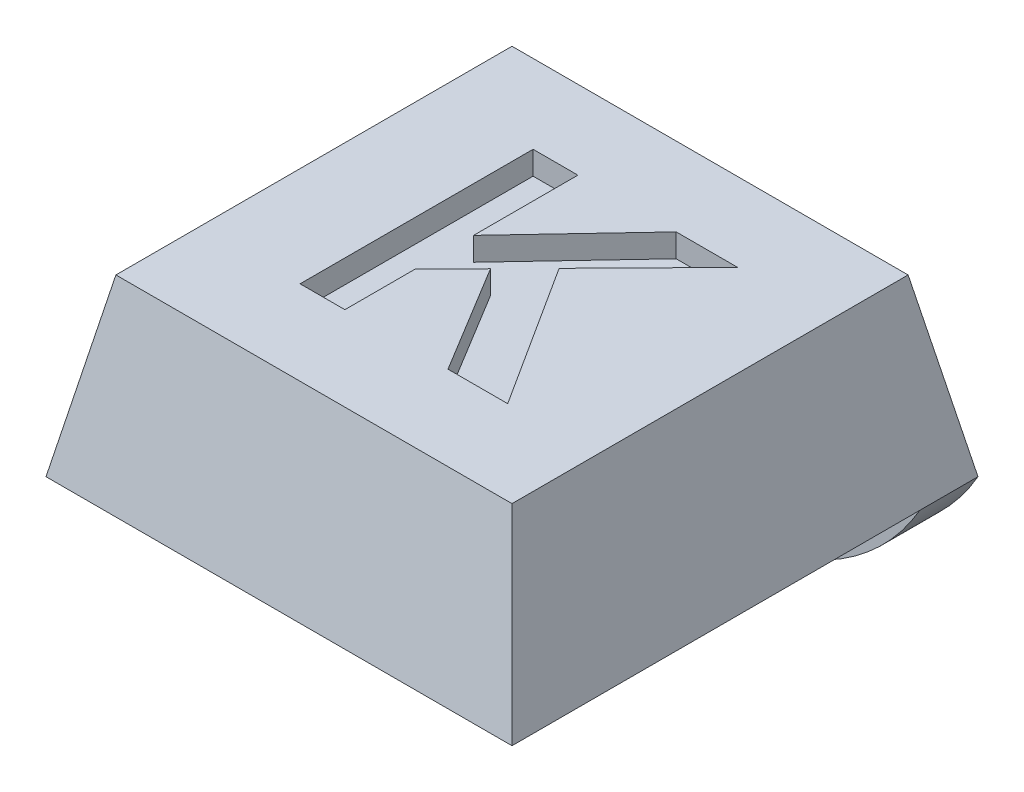
ISO-10303-21;
HEADER;
FILE_DESCRIPTION(('STEP AP214'),'2;1');
FILE_NAME('part.step','',(''),(''),'','','');
FILE_SCHEMA(('AUTOMOTIVE_DESIGN { 1 0 10303 214 1 1 1 1 }'));
ENDSEC;
DATA;
#1=APPLICATION_CONTEXT('core data for automotive mechanical design processes');
#2=APPLICATION_PROTOCOL_DEFINITION('international standard','automotive_design',2000,#1);
#3=PRODUCT_CONTEXT('',#1,'mechanical');
#4=PRODUCT('Part','Part','',(#3));
#5=PRODUCT_RELATED_PRODUCT_CATEGORY('part','',(#4));
#6=PRODUCT_DEFINITION_FORMATION('','',#4);
#7=PRODUCT_DEFINITION_CONTEXT('part definition',#1,'design');
#8=PRODUCT_DEFINITION('design','',#6,#7);
#9=PRODUCT_DEFINITION_SHAPE('','',#8);
#10=(LENGTH_UNIT() NAMED_UNIT(*) SI_UNIT(.MILLI.,.METRE.));
#11=(NAMED_UNIT(*) PLANE_ANGLE_UNIT() SI_UNIT($,.RADIAN.));
#12=(NAMED_UNIT(*) SI_UNIT($,.STERADIAN.) SOLID_ANGLE_UNIT());
#13=UNCERTAINTY_MEASURE_WITH_UNIT(LENGTH_MEASURE(1.E-05),#10,'distance_accuracy_value','');
#14=(GEOMETRIC_REPRESENTATION_CONTEXT(3) GLOBAL_UNCERTAINTY_ASSIGNED_CONTEXT((#13)) GLOBAL_UNIT_ASSIGNED_CONTEXT((#10,
#11,#12)) REPRESENTATION_CONTEXT('',''));
#15=CARTESIAN_POINT('',(0.,0.,0.));
#16=DIRECTION('',(0.,0.,1.));
#17=DIRECTION('',(1.,0.,0.));
#18=AXIS2_PLACEMENT_3D('',#15,#16,#17);
#19=CARTESIAN_POINT('',(0.,3.,0.));
#20=DIRECTION('',(0.,-1.,0.));
#21=DIRECTION('',(0.,0.,-1.));
#22=AXIS2_PLACEMENT_3D('',#19,#20,#21);
#23=PLANE('',#22);
#24=DIRECTION('',(-1.,0.,0.));
#25=VECTOR('',#24,1.);
#26=CARTESIAN_POINT('',(11.,3.,-0.6));
#27=LINE('',#26,#25);
#28=CARTESIAN_POINT('',(7.4,3.,-0.6));
#29=VERTEX_POINT('',#28);
#30=CARTESIAN_POINT('',(0.6,3.,-0.6));
#31=VERTEX_POINT('',#30);
#32=EDGE_CURVE('E229',#29,#31,#27,.T.);
#33=ORIENTED_EDGE('',*,*,#32,.F.);
#34=DIRECTION('',(0.,0.,1.));
#35=VECTOR('',#34,1.);
#36=CARTESIAN_POINT('',(7.4,3.,-8.));
#37=LINE('',#36,#35);
#38=CARTESIAN_POINT('',(7.4,3.,-7.4));
#39=VERTEX_POINT('',#38);
#40=EDGE_CURVE('E242',#39,#29,#37,.T.);
#41=ORIENTED_EDGE('',*,*,#40,.F.);
#42=DIRECTION('',(-1.,0.,0.));
#43=VECTOR('',#42,1.);
#44=CARTESIAN_POINT('',(11.,3.,-7.4));
#45=LINE('',#44,#43);
#46=CARTESIAN_POINT('',(0.599999999999999,3.,-7.4));
#47=VERTEX_POINT('',#46);
#48=EDGE_CURVE('E225',#39,#47,#45,.T.);
#49=ORIENTED_EDGE('',*,*,#48,.T.);
#50=DIRECTION('',(0.,0.,1.));
#51=VECTOR('',#50,1.);
#52=CARTESIAN_POINT('',(0.6,3.,-8.));
#53=LINE('',#52,#51);
#54=EDGE_CURVE('E245',#47,#31,#53,.T.);
#55=ORIENTED_EDGE('',*,*,#54,.T.);
#56=EDGE_LOOP('',(#33,#41,#49,#55));
#57=FACE_BOUND('',#56,.T.);
#58=DIRECTION('',(-1.,0.,0.));
#59=VECTOR('',#58,1.);
#60=CARTESIAN_POINT('',(3.08212967996157,3.,-2.04912159051481));
#61=LINE('',#60,#59);
#62=CARTESIAN_POINT('',(3.08212967996157,3.,-2.04912159051481));
#63=VERTEX_POINT('',#62);
#64=CARTESIAN_POINT('',(2.3128989107308,3.,-2.04912159051481));
#65=VERTEX_POINT('',#64);
#66=EDGE_CURVE('E58',#63,#65,#61,.T.);
#67=ORIENTED_EDGE('',*,*,#66,.T.);
#68=DIRECTION('',(0.,0.,-1.));
#69=VECTOR('',#68,1.);
#70=CARTESIAN_POINT('',(2.3128989107308,3.,-2.04912159051481));
#71=LINE('',#70,#69);
#72=CARTESIAN_POINT('',(2.3128989107308,3.,-6.04912159051481));
#73=VERTEX_POINT('',#72);
#74=EDGE_CURVE('E197',#65,#73,#71,.T.);
#75=ORIENTED_EDGE('',*,*,#74,.T.);
#76=DIRECTION('',(1.,0.,0.));
#77=VECTOR('',#76,1.);
#78=CARTESIAN_POINT('',(2.3128989107308,3.,-6.04912159051481));
#79=LINE('',#78,#77);
#80=CARTESIAN_POINT('',(3.08212967996157,3.,-6.04912159051481));
#81=VERTEX_POINT('',#80);
#82=EDGE_CURVE('E666',#73,#81,#79,.T.);
#83=ORIENTED_EDGE('',*,*,#82,.T.);
#84=DIRECTION('',(0.,0.,1.));
#85=VECTOR('',#84,1.);
#86=CARTESIAN_POINT('',(3.08212967996157,3.,-6.04912159051481));
#87=LINE('',#86,#85);
#88=CARTESIAN_POINT('',(3.08212967996157,3.,-4.25825620589942));
#89=VERTEX_POINT('',#88);
#90=EDGE_CURVE('E668',#81,#89,#87,.T.);
#91=ORIENTED_EDGE('',*,*,#90,.T.);
#92=DIRECTION('',(0.685618651018228,0.,-0.727960895499164));
#93=VECTOR('',#92,1.);
#94=CARTESIAN_POINT('',(3.08212967996157,3.,-4.25825620589942));
#95=LINE('',#94,#93);
#96=CARTESIAN_POINT('',(4.76882839791029,3.,-6.04912159051481));
#97=VERTEX_POINT('',#96);
#98=EDGE_CURVE('E673',#89,#97,#95,.T.);
#99=ORIENTED_EDGE('',*,*,#98,.T.);
#100=DIRECTION('',(1.,0.,0.));
#101=VECTOR('',#100,1.);
#102=CARTESIAN_POINT('',(4.76882839791029,3.,-6.04912159051481));
#103=LINE('',#102,#101);
#104=CARTESIAN_POINT('',(5.82571942355132,3.,-6.04912159051481));
#105=VERTEX_POINT('',#104);
#106=EDGE_CURVE('E683',#97,#105,#103,.T.);
#107=ORIENTED_EDGE('',*,*,#106,.T.);
#108=DIRECTION('',(-0.700795359660879,0.,0.713362365055642));
#109=VECTOR('',#108,1.);
#110=CARTESIAN_POINT('',(5.82571942355132,3.,-6.04912159051481));
#111=LINE('',#110,#109);
#112=CARTESIAN_POINT('',(4.30648865432055,3.,-4.50264723154045));
#113=VERTEX_POINT('',#112);
#114=EDGE_CURVE('E687',#105,#113,#111,.T.);
#115=ORIENTED_EDGE('',*,*,#114,.T.);
#116=DIRECTION('',(0.53911613745139,0.,0.842231435140896));
#117=VECTOR('',#116,1.);
#118=CARTESIAN_POINT('',(4.30648865432055,3.,-4.50264723154045));
#119=LINE('',#118,#117);
#120=CARTESIAN_POINT('',(5.87700147483337,3.,-2.04912159051481));
#121=VERTEX_POINT('',#120);
#122=EDGE_CURVE('E691',#113,#121,#119,.T.);
#123=ORIENTED_EDGE('',*,*,#122,.T.);
#124=DIRECTION('',(-1.,0.,0.));
#125=VECTOR('',#124,1.);
#126=CARTESIAN_POINT('',(5.87700147483337,3.,-2.04912159051481));
#127=LINE('',#126,#125);
#128=CARTESIAN_POINT('',(4.85216173124363,3.,-2.04912159051481));
#129=VERTEX_POINT('',#128);
#130=EDGE_CURVE('E632',#121,#129,#127,.T.);
#131=ORIENTED_EDGE('',*,*,#130,.T.);
#132=DIRECTION('',(-0.519256993232864,0.,-0.854618145711151));
#133=VECTOR('',#132,1.);
#134=CARTESIAN_POINT('',(4.85216173124363,3.,-2.04912159051481));
#135=LINE('',#134,#133);
#136=CARTESIAN_POINT('',(3.72315532098721,3.,-3.90729466743788));
#137=VERTEX_POINT('',#136);
#138=EDGE_CURVE('E627',#129,#137,#135,.T.);
#139=ORIENTED_EDGE('',*,*,#138,.T.);
#140=DIRECTION('',(-0.70094689597696,0.,0.713213466656557));
#141=VECTOR('',#140,1.);
#142=CARTESIAN_POINT('',(3.72315532098721,3.,-3.90729466743788));
#143=LINE('',#142,#141);
#144=CARTESIAN_POINT('',(3.08212967996157,3.,-3.25505107769429));
#145=VERTEX_POINT('',#144);
#146=EDGE_CURVE('E621',#137,#145,#143,.T.);
#147=ORIENTED_EDGE('',*,*,#146,.T.);
#148=DIRECTION('',(0.,0.,1.));
#149=VECTOR('',#148,1.);
#150=CARTESIAN_POINT('',(3.08212967996157,3.,-3.25505107769429));
#151=LINE('',#150,#149);
#152=EDGE_CURVE('E193',#145,#63,#151,.T.);
#153=ORIENTED_EDGE('',*,*,#152,.T.);
#154=EDGE_LOOP('',(#67,#75,#83,#91,#99,#107,#115,#123,#131,#139,#147,#153));
#155=FACE_BOUND('',#154,.T.);
#156=ADVANCED_FACE('F42',(#57,#155),#23,.F.);
#157=CARTESIAN_POINT('',(8.,0.,-8.));
#158=DIRECTION('',(-0.98058067569092,-0.196116135138184,0.));
#159=DIRECTION('',(0.196116135138184,-0.98058067569092,0.));
#160=AXIS2_PLACEMENT_3D('',#157,#158,#159);
#161=PLANE('',#160);
#162=DIRECTION('',(-0.192450089729875,0.962250448649376,-0.192450089729875));
#163=VECTOR('',#162,1.);
#164=CARTESIAN_POINT('',(7.7037037037037,1.48148148148148,-0.296296296296296));
#165=LINE('',#164,#163);
#166=CARTESIAN_POINT('',(8.,0.,0.));
#167=VERTEX_POINT('',#166);
#168=EDGE_CURVE('E239',#167,#29,#165,.T.);
#169=ORIENTED_EDGE('',*,*,#168,.F.);
#170=DIRECTION('',(0.,0.,-1.));
#171=VECTOR('',#170,1.);
#172=CARTESIAN_POINT('',(8.,0.,0.));
#173=LINE('',#172,#171);
#174=CARTESIAN_POINT('',(8.,0.,-7.));
#175=VERTEX_POINT('',#174);
#176=EDGE_CURVE('E258',#167,#175,#173,.T.);
#177=ORIENTED_EDGE('',*,*,#176,.T.);
#178=DIRECTION('',(0.,0.,1.));
#179=VECTOR('',#178,1.);
#180=CARTESIAN_POINT('',(8.,0.,-8.));
#181=LINE('',#180,#179);
#182=CARTESIAN_POINT('',(8.,0.,-8.));
#183=VERTEX_POINT('',#182);
#184=EDGE_CURVE('E199',#183,#175,#181,.T.);
#185=ORIENTED_EDGE('',*,*,#184,.F.);
#186=DIRECTION('',(0.192450089729875,-0.962250448649376,-0.192450089729875));
#187=VECTOR('',#186,1.);
#188=CARTESIAN_POINT('',(8.,0.,-8.));
#189=LINE('',#188,#187);
#190=EDGE_CURVE('E232',#39,#183,#189,.T.);
#191=ORIENTED_EDGE('',*,*,#190,.F.);
#192=ORIENTED_EDGE('',*,*,#40,.T.);
#193=EDGE_LOOP('',(#169,#177,#185,#191,#192));
#194=FACE_BOUND('',#193,.T.);
#195=ADVANCED_FACE('F326',(#194),#161,.F.);
#196=CARTESIAN_POINT('',(0.,0.,-8.));
#197=DIRECTION('',(0.98058067569092,-0.196116135138184,0.));
#198=DIRECTION('',(0.196116135138184,0.98058067569092,0.));
#199=AXIS2_PLACEMENT_3D('',#196,#197,#198);
#200=PLANE('',#199);
#201=DIRECTION('',(-0.192450089729875,-0.962250448649376,0.192450089729875));
#202=VECTOR('',#201,1.);
#203=CARTESIAN_POINT('',(0.296296296296296,1.48148148148148,-0.296296296296296));
#204=LINE('',#203,#202);
#205=CARTESIAN_POINT('',(0.,0.,0.));
#206=VERTEX_POINT('',#205);
#207=EDGE_CURVE('E286',#31,#206,#204,.T.);
#208=ORIENTED_EDGE('',*,*,#207,.F.);
#209=ORIENTED_EDGE('',*,*,#54,.F.);
#210=DIRECTION('',(0.192450089729875,0.962250448649376,0.192450089729875));
#211=VECTOR('',#210,1.);
#212=CARTESIAN_POINT('',(0.,0.,-8.));
#213=LINE('',#212,#211);
#214=CARTESIAN_POINT('',(0.,0.,-8.));
#215=VERTEX_POINT('',#214);
#216=EDGE_CURVE('E257',#215,#47,#213,.T.);
#217=ORIENTED_EDGE('',*,*,#216,.F.);
#218=DIRECTION('',(0.,0.,1.));
#219=VECTOR('',#218,1.);
#220=CARTESIAN_POINT('',(0.,0.,0.));
#221=LINE('',#220,#219);
#222=CARTESIAN_POINT('',(0.,0.,-7.));
#223=VERTEX_POINT('',#222);
#224=EDGE_CURVE('E262',#215,#223,#221,.T.);
#225=ORIENTED_EDGE('',*,*,#224,.T.);
#226=EDGE_CURVE('E249',#223,#206,#221,.T.);
#227=ORIENTED_EDGE('',*,*,#226,.T.);
#228=EDGE_LOOP('',(#208,#209,#217,#225,#227));
#229=FACE_BOUND('',#228,.T.);
#230=ADVANCED_FACE('F310',(#229),#200,.F.);
#231=CARTESIAN_POINT('',(0.,0.,0.));
#232=DIRECTION('',(0.,-1.,0.));
#233=DIRECTION('',(0.,0.,-1.));
#234=AXIS2_PLACEMENT_3D('',#231,#232,#233);
#235=PLANE('',#234);
#236=DIRECTION('',(-1.,0.,0.));
#237=VECTOR('',#236,1.);
#238=CARTESIAN_POINT('',(0.,0.,-7.));
#239=LINE('',#238,#237);
#240=EDGE_CURVE('E205',#175,#223,#239,.T.);
#241=ORIENTED_EDGE('',*,*,#240,.F.);
#242=ORIENTED_EDGE('',*,*,#176,.F.);
#243=DIRECTION('',(1.,0.,0.));
#244=VECTOR('',#243,1.);
#245=CARTESIAN_POINT('',(0.,0.,0.));
#246=LINE('',#245,#244);
#247=EDGE_CURVE('E259',#206,#167,#246,.T.);
#248=ORIENTED_EDGE('',*,*,#247,.F.);
#249=ORIENTED_EDGE('',*,*,#226,.F.);
#250=EDGE_LOOP('',(#241,#242,#248,#249));
#251=FACE_BOUND('',#250,.T.);
#252=CARTESIAN_POINT('',(4.,0.,-3.75));
#253=DIRECTION('',(0.,-1.,0.));
#254=DIRECTION('',(0.,0.,-1.));
#255=AXIS2_PLACEMENT_3D('',#252,#253,#254);
#256=CIRCLE('',#255,1.8);
#257=CARTESIAN_POINT('',(4.,0.,-5.55));
#258=VERTEX_POINT('',#257);
#259=EDGE_CURVE('E217',#258,#258,#256,.T.);
#260=ORIENTED_EDGE('',*,*,#259,.F.);
#261=EDGE_LOOP('',(#260));
#262=FACE_BOUND('',#261,.T.);
#263=ADVANCED_FACE('F321',(#251,#262),#235,.T.);
#264=CARTESIAN_POINT('',(11.,3.,-7.4));
#265=DIRECTION('',(0.,0.196116135138184,-0.98058067569092));
#266=DIRECTION('',(0.,0.98058067569092,0.196116135138184));
#267=AXIS2_PLACEMENT_3D('',#264,#265,#266);
#268=PLANE('',#267);
#269=ORIENTED_EDGE('',*,*,#190,.T.);
#270=DIRECTION('',(-1.,0.,0.));
#271=VECTOR('',#270,1.);
#272=CARTESIAN_POINT('',(0.,0.,-8.));
#273=LINE('',#272,#271);
#274=EDGE_CURVE('E253',#183,#215,#273,.T.);
#275=ORIENTED_EDGE('',*,*,#274,.T.);
#276=ORIENTED_EDGE('',*,*,#216,.T.);
#277=ORIENTED_EDGE('',*,*,#48,.F.);
#278=EDGE_LOOP('',(#269,#275,#276,#277));
#279=FACE_BOUND('',#278,.T.);
#280=ADVANCED_FACE('F305',(#279),#268,.T.);
#281=CARTESIAN_POINT('',(11.,0.,0.));
#282=DIRECTION('',(0.,0.196116135138184,0.98058067569092));
#283=DIRECTION('',(0.,-0.98058067569092,0.196116135138184));
#284=AXIS2_PLACEMENT_3D('',#281,#282,#283);
#285=PLANE('',#284);
#286=ORIENTED_EDGE('',*,*,#168,.T.);
#287=ORIENTED_EDGE('',*,*,#32,.T.);
#288=ORIENTED_EDGE('',*,*,#207,.T.);
#289=ORIENTED_EDGE('',*,*,#247,.T.);
#290=EDGE_LOOP('',(#286,#287,#288,#289));
#291=FACE_BOUND('',#290,.T.);
#292=ADVANCED_FACE('F352',(#291),#285,.T.);
#293=CARTESIAN_POINT('',(4.,0.8,-3.75));
#294=DIRECTION('',(0.,-1.,0.));
#295=DIRECTION('',(0.,0.,-1.));
#296=AXIS2_PLACEMENT_3D('',#293,#294,#295);
#297=CYLINDRICAL_SURFACE('',#296,1.8);
#298=CARTESIAN_POINT('',(4.,0.8,-3.75));
#299=DIRECTION('',(0.,-1.,0.));
#300=DIRECTION('',(0.,0.,-1.));
#301=AXIS2_PLACEMENT_3D('',#298,#299,#300);
#302=CIRCLE('',#301,1.8);
#303=CARTESIAN_POINT('',(4.,0.8,-5.55));
#304=VERTEX_POINT('',#303);
#305=EDGE_CURVE('E221',#304,#304,#302,.T.);
#306=ORIENTED_EDGE('',*,*,#305,.F.);
#307=EDGE_LOOP('',(#306));
#308=FACE_BOUND('',#307,.T.);
#309=ORIENTED_EDGE('',*,*,#259,.T.);
#310=EDGE_LOOP('',(#309));
#311=FACE_BOUND('',#310,.T.);
#312=ADVANCED_FACE('F359',(#308,#311),#297,.F.);
#313=CARTESIAN_POINT('',(4.,0.8,-3.75));
#314=DIRECTION('',(0.,-1.,0.));
#315=DIRECTION('',(0.,0.,-1.));
#316=AXIS2_PLACEMENT_3D('',#313,#314,#315);
#317=PLANE('',#316);
#318=ORIENTED_EDGE('',*,*,#305,.T.);
#319=EDGE_LOOP('',(#318));
#320=FACE_BOUND('',#319,.T.);
#321=ADVANCED_FACE('F363',(#320),#317,.T.);
#322=CARTESIAN_POINT('',(0.,-2.,-8.));
#323=DIRECTION('',(0.,0.,1.));
#324=DIRECTION('',(1.,0.,0.));
#325=AXIS2_PLACEMENT_3D('',#322,#323,#324);
#326=PLANE('',#325);
#327=ORIENTED_EDGE('',*,*,#274,.F.);
#328=CARTESIAN_POINT('',(4.53589838486225,2.,-8.));
#329=DIRECTION('',(0.,0.,1.));
#330=DIRECTION('',(1.,0.,0.));
#331=AXIS2_PLACEMENT_3D('',#328,#329,#330);
#332=CIRCLE('',#331,4.);
#333=CARTESIAN_POINT('',(4.53589838486225,-2.,-8.));
#334=VERTEX_POINT('',#333);
#335=EDGE_CURVE('E11',#183,#334,#332,.F.);
#336=ORIENTED_EDGE('',*,*,#335,.T.);
#337=DIRECTION('',(1.,0.,0.));
#338=VECTOR('',#337,1.);
#339=CARTESIAN_POINT('',(0.,-2.,-8.));
#340=LINE('',#339,#338);
#341=CARTESIAN_POINT('',(3.46410161513775,-2.,-8.));
#342=VERTEX_POINT('',#341);
#343=EDGE_CURVE('E211',#342,#334,#340,.T.);
#344=ORIENTED_EDGE('',*,*,#343,.F.);
#345=CARTESIAN_POINT('',(3.46410161513775,2.,-8.));
#346=DIRECTION('',(0.,0.,1.));
#347=DIRECTION('',(1.,0.,0.));
#348=AXIS2_PLACEMENT_3D('',#345,#346,#347);
#349=CIRCLE('',#348,4.);
#350=EDGE_CURVE('E51',#342,#215,#349,.F.);
#351=ORIENTED_EDGE('',*,*,#350,.T.);
#352=EDGE_LOOP('',(#327,#336,#344,#351));
#353=FACE_BOUND('',#352,.T.);
#354=ADVANCED_FACE('F298',(#353),#326,.F.);
#355=CARTESIAN_POINT('',(0.,-2.,-7.));
#356=DIRECTION('',(0.,0.,-1.));
#357=DIRECTION('',(-1.,0.,0.));
#358=AXIS2_PLACEMENT_3D('',#355,#356,#357);
#359=PLANE('',#358);
#360=DIRECTION('',(-1.,0.,0.));
#361=VECTOR('',#360,1.);
#362=CARTESIAN_POINT('',(0.,-2.,-7.));
#363=LINE('',#362,#361);
#364=CARTESIAN_POINT('',(4.53589838486225,-2.,-7.));
#365=VERTEX_POINT('',#364);
#366=CARTESIAN_POINT('',(3.46410161513775,-2.,-7.));
#367=VERTEX_POINT('',#366);
#368=EDGE_CURVE('E215',#365,#367,#363,.T.);
#369=ORIENTED_EDGE('',*,*,#368,.F.);
#370=CARTESIAN_POINT('',(4.53589838486225,2.,-7.));
#371=DIRECTION('',(0.,0.,-1.));
#372=DIRECTION('',(-1.,0.,0.));
#373=AXIS2_PLACEMENT_3D('',#370,#371,#372);
#374=CIRCLE('',#373,4.);
#375=EDGE_CURVE('E292',#365,#175,#374,.F.);
#376=ORIENTED_EDGE('',*,*,#375,.T.);
#377=ORIENTED_EDGE('',*,*,#240,.T.);
#378=CARTESIAN_POINT('',(3.46410161513775,2.,-7.));
#379=DIRECTION('',(0.,0.,-1.));
#380=DIRECTION('',(-1.,0.,0.));
#381=AXIS2_PLACEMENT_3D('',#378,#379,#380);
#382=CIRCLE('',#381,4.);
#383=EDGE_CURVE('E66',#223,#367,#382,.F.);
#384=ORIENTED_EDGE('',*,*,#383,.T.);
#385=EDGE_LOOP('',(#369,#376,#377,#384));
#386=FACE_BOUND('',#385,.T.);
#387=ADVANCED_FACE('F316',(#386),#359,.F.);
#388=CARTESIAN_POINT('',(0.,-2.,0.));
#389=DIRECTION('',(0.,1.,0.));
#390=DIRECTION('',(0.,0.,1.));
#391=AXIS2_PLACEMENT_3D('',#388,#389,#390);
#392=PLANE('',#391);
#393=ORIENTED_EDGE('',*,*,#343,.T.);
#394=DIRECTION('',(0.,0.,1.));
#395=VECTOR('',#394,1.);
#396=CARTESIAN_POINT('',(4.53589838486225,-2.,0.));
#397=LINE('',#396,#395);
#398=EDGE_CURVE('E285',#334,#365,#397,.T.);
#399=ORIENTED_EDGE('',*,*,#398,.T.);
#400=ORIENTED_EDGE('',*,*,#368,.T.);
#401=DIRECTION('',(0.,0.,-1.));
#402=VECTOR('',#401,1.);
#403=CARTESIAN_POINT('',(3.46410161513775,-2.,0.));
#404=LINE('',#403,#402);
#405=EDGE_CURVE('E281',#367,#342,#404,.T.);
#406=ORIENTED_EDGE('',*,*,#405,.T.);
#407=EDGE_LOOP('',(#393,#399,#400,#406));
#408=FACE_BOUND('',#407,.T.);
#409=ADVANCED_FACE('F314',(#408),#392,.F.);
#410=CARTESIAN_POINT('',(4.53589838486225,2.,-8.));
#411=DIRECTION('',(0.,0.,1.));
#412=DIRECTION('',(1.,0.,0.));
#413=AXIS2_PLACEMENT_3D('',#410,#411,#412);
#414=CYLINDRICAL_SURFACE('',#413,4.);
#415=ORIENTED_EDGE('',*,*,#335,.F.);
#416=ORIENTED_EDGE('',*,*,#184,.T.);
#417=ORIENTED_EDGE('',*,*,#375,.F.);
#418=ORIENTED_EDGE('',*,*,#398,.F.);
#419=EDGE_LOOP('',(#415,#416,#417,#418));
#420=FACE_BOUND('',#419,.T.);
#421=ADVANCED_FACE('F327',(#420),#414,.T.);
#422=CARTESIAN_POINT('',(3.46410161513775,2.,-8.));
#423=DIRECTION('',(0.,0.,-1.));
#424=DIRECTION('',(-1.,0.,0.));
#425=AXIS2_PLACEMENT_3D('',#422,#423,#424);
#426=CYLINDRICAL_SURFACE('',#425,4.);
#427=ORIENTED_EDGE('',*,*,#383,.F.);
#428=ORIENTED_EDGE('',*,*,#224,.F.);
#429=ORIENTED_EDGE('',*,*,#350,.F.);
#430=ORIENTED_EDGE('',*,*,#405,.F.);
#431=EDGE_LOOP('',(#427,#428,#429,#430));
#432=FACE_BOUND('',#431,.T.);
#433=ADVANCED_FACE('F44',(#432),#426,.T.);
#434=CARTESIAN_POINT('',(3.08212967996157,2.6,-2.04912159051481));
#435=DIRECTION('',(0.,0.,-1.));
#436=DIRECTION('',(-1.,0.,0.));
#437=AXIS2_PLACEMENT_3D('',#434,#435,#436);
#438=PLANE('',#437);
#439=ORIENTED_EDGE('',*,*,#66,.F.);
#440=DIRECTION('',(0.,1.,0.));
#441=VECTOR('',#440,1.);
#442=CARTESIAN_POINT('',(3.08212967996157,2.6,-2.04912159051481));
#443=LINE('',#442,#441);
#444=CARTESIAN_POINT('',(3.08212967996157,2.6,-2.04912159051481));
#445=VERTEX_POINT('',#444);
#446=EDGE_CURVE('E191',#445,#63,#443,.T.);
#447=ORIENTED_EDGE('',*,*,#446,.F.);
#448=DIRECTION('',(-1.,0.,0.));
#449=VECTOR('',#448,1.);
#450=CARTESIAN_POINT('',(3.08212967996157,2.6,-2.04912159051481));
#451=LINE('',#450,#449);
#452=CARTESIAN_POINT('',(2.3128989107308,2.6,-2.04912159051481));
#453=VERTEX_POINT('',#452);
#454=EDGE_CURVE('E181',#445,#453,#451,.T.);
#455=ORIENTED_EDGE('',*,*,#454,.T.);
#456=DIRECTION('',(0.,1.,0.));
#457=VECTOR('',#456,1.);
#458=CARTESIAN_POINT('',(2.3128989107308,2.6,-2.04912159051481));
#459=LINE('',#458,#457);
#460=EDGE_CURVE('E190',#453,#65,#459,.T.);
#461=ORIENTED_EDGE('',*,*,#460,.T.);
#462=EDGE_LOOP('',(#439,#447,#455,#461));
#463=FACE_BOUND('',#462,.T.);
#464=ADVANCED_FACE('F189',(#463),#438,.T.);
#465=CARTESIAN_POINT('',(2.3128989107308,2.6,-2.04912159051481));
#466=DIRECTION('',(1.,0.,0.));
#467=DIRECTION('',(0.,0.,-1.));
#468=AXIS2_PLACEMENT_3D('',#465,#466,#467);
#469=PLANE('',#468);
#470=ORIENTED_EDGE('',*,*,#74,.F.);
#471=ORIENTED_EDGE('',*,*,#460,.F.);
#472=DIRECTION('',(0.,0.,-1.));
#473=VECTOR('',#472,1.);
#474=CARTESIAN_POINT('',(2.3128989107308,2.6,-2.04912159051481));
#475=LINE('',#474,#473);
#476=CARTESIAN_POINT('',(2.3128989107308,2.6,-6.04912159051481));
#477=VERTEX_POINT('',#476);
#478=EDGE_CURVE('E177',#453,#477,#475,.T.);
#479=ORIENTED_EDGE('',*,*,#478,.T.);
#480=DIRECTION('',(0.,1.,0.));
#481=VECTOR('',#480,1.);
#482=CARTESIAN_POINT('',(2.3128989107308,2.6,-6.04912159051481));
#483=LINE('',#482,#481);
#484=EDGE_CURVE('E200',#477,#73,#483,.T.);
#485=ORIENTED_EDGE('',*,*,#484,.T.);
#486=EDGE_LOOP('',(#470,#471,#479,#485));
#487=FACE_BOUND('',#486,.T.);
#488=ADVANCED_FACE('F195',(#487),#469,.T.);
#489=CARTESIAN_POINT('',(2.3128989107308,2.6,-6.04912159051481));
#490=DIRECTION('',(0.,0.,1.));
#491=DIRECTION('',(1.,0.,0.));
#492=AXIS2_PLACEMENT_3D('',#489,#490,#491);
#493=PLANE('',#492);
#494=ORIENTED_EDGE('',*,*,#82,.F.);
#495=ORIENTED_EDGE('',*,*,#484,.F.);
#496=DIRECTION('',(1.,0.,0.));
#497=VECTOR('',#496,1.);
#498=CARTESIAN_POINT('',(2.3128989107308,2.6,-6.04912159051481));
#499=LINE('',#498,#497);
#500=CARTESIAN_POINT('',(3.08212967996157,2.6,-6.04912159051481));
#501=VERTEX_POINT('',#500);
#502=EDGE_CURVE('E183',#477,#501,#499,.T.);
#503=ORIENTED_EDGE('',*,*,#502,.T.);
#504=DIRECTION('',(0.,1.,0.));
#505=VECTOR('',#504,1.);
#506=CARTESIAN_POINT('',(3.08212967996157,2.6,-6.04912159051481));
#507=LINE('',#506,#505);
#508=EDGE_CURVE('E207',#501,#81,#507,.T.);
#509=ORIENTED_EDGE('',*,*,#508,.T.);
#510=EDGE_LOOP('',(#494,#495,#503,#509));
#511=FACE_BOUND('',#510,.T.);
#512=ADVANCED_FACE('F376',(#511),#493,.T.);
#513=CARTESIAN_POINT('',(3.08212967996157,2.6,-6.04912159051481));
#514=DIRECTION('',(-1.,0.,0.));
#515=DIRECTION('',(0.,0.,1.));
#516=AXIS2_PLACEMENT_3D('',#513,#514,#515);
#517=PLANE('',#516);
#518=ORIENTED_EDGE('',*,*,#90,.F.);
#519=ORIENTED_EDGE('',*,*,#508,.F.);
#520=DIRECTION('',(0.,0.,1.));
#521=VECTOR('',#520,1.);
#522=CARTESIAN_POINT('',(3.08212967996157,2.6,-6.04912159051481));
#523=LINE('',#522,#521);
#524=CARTESIAN_POINT('',(3.08212967996157,2.6,-4.25825620589942));
#525=VERTEX_POINT('',#524);
#526=EDGE_CURVE('E727',#501,#525,#523,.T.);
#527=ORIENTED_EDGE('',*,*,#526,.T.);
#528=DIRECTION('',(0.,1.,0.));
#529=VECTOR('',#528,1.);
#530=CARTESIAN_POINT('',(3.08212967996157,2.6,-4.25825620589942));
#531=LINE('',#530,#529);
#532=EDGE_CURVE('E659',#525,#89,#531,.T.);
#533=ORIENTED_EDGE('',*,*,#532,.T.);
#534=EDGE_LOOP('',(#518,#519,#527,#533));
#535=FACE_BOUND('',#534,.T.);
#536=ADVANCED_FACE('F379',(#535),#517,.T.);
#537=CARTESIAN_POINT('',(3.08212967996157,2.6,-4.25825620589942));
#538=DIRECTION('',(0.727960895499164,0.,0.685618651018228));
#539=DIRECTION('',(0.685618651018228,0.,-0.727960895499164));
#540=AXIS2_PLACEMENT_3D('',#537,#538,#539);
#541=PLANE('',#540);
#542=ORIENTED_EDGE('',*,*,#98,.F.);
#543=ORIENTED_EDGE('',*,*,#532,.F.);
#544=DIRECTION('',(0.685618651018228,0.,-0.727960895499164));
#545=VECTOR('',#544,1.);
#546=CARTESIAN_POINT('',(3.08212967996157,2.6,-4.25825620589942));
#547=LINE('',#546,#545);
#548=CARTESIAN_POINT('',(4.76882839791029,2.6,-6.04912159051481));
#549=VERTEX_POINT('',#548);
#550=EDGE_CURVE('E724',#525,#549,#547,.T.);
#551=ORIENTED_EDGE('',*,*,#550,.T.);
#552=DIRECTION('',(0.,1.,0.));
#553=VECTOR('',#552,1.);
#554=CARTESIAN_POINT('',(4.76882839791029,2.6,-6.04912159051481));
#555=LINE('',#554,#553);
#556=EDGE_CURVE('E656',#549,#97,#555,.T.);
#557=ORIENTED_EDGE('',*,*,#556,.T.);
#558=EDGE_LOOP('',(#542,#543,#551,#557));
#559=FACE_BOUND('',#558,.T.);
#560=ADVANCED_FACE('F383',(#559),#541,.T.);
#561=CARTESIAN_POINT('',(4.76882839791029,2.6,-6.04912159051481));
#562=DIRECTION('',(0.,0.,1.));
#563=DIRECTION('',(1.,0.,0.));
#564=AXIS2_PLACEMENT_3D('',#561,#562,#563);
#565=PLANE('',#564);
#566=ORIENTED_EDGE('',*,*,#106,.F.);
#567=ORIENTED_EDGE('',*,*,#556,.F.);
#568=DIRECTION('',(1.,0.,0.));
#569=VECTOR('',#568,1.);
#570=CARTESIAN_POINT('',(4.76882839791029,2.6,-6.04912159051481));
#571=LINE('',#570,#569);
#572=CARTESIAN_POINT('',(5.82571942355132,2.6,-6.04912159051481));
#573=VERTEX_POINT('',#572);
#574=EDGE_CURVE('E721',#549,#573,#571,.T.);
#575=ORIENTED_EDGE('',*,*,#574,.T.);
#576=DIRECTION('',(0.,1.,0.));
#577=VECTOR('',#576,1.);
#578=CARTESIAN_POINT('',(5.82571942355132,2.6,-6.04912159051481));
#579=LINE('',#578,#577);
#580=EDGE_CURVE('E653',#573,#105,#579,.T.);
#581=ORIENTED_EDGE('',*,*,#580,.T.);
#582=EDGE_LOOP('',(#566,#567,#575,#581));
#583=FACE_BOUND('',#582,.T.);
#584=ADVANCED_FACE('F387',(#583),#565,.T.);
#585=CARTESIAN_POINT('',(5.82571942355132,2.6,-6.04912159051481));
#586=DIRECTION('',(-0.713362365055642,0.,-0.700795359660879));
#587=DIRECTION('',(-0.700795359660879,0.,0.713362365055642));
#588=AXIS2_PLACEMENT_3D('',#585,#586,#587);
#589=PLANE('',#588);
#590=ORIENTED_EDGE('',*,*,#114,.F.);
#591=ORIENTED_EDGE('',*,*,#580,.F.);
#592=DIRECTION('',(-0.700795359660879,0.,0.713362365055642));
#593=VECTOR('',#592,1.);
#594=CARTESIAN_POINT('',(5.82571942355132,2.6,-6.04912159051481));
#595=LINE('',#594,#593);
#596=CARTESIAN_POINT('',(4.30648865432055,2.6,-4.50264723154045));
#597=VERTEX_POINT('',#596);
#598=EDGE_CURVE('E718',#573,#597,#595,.T.);
#599=ORIENTED_EDGE('',*,*,#598,.T.);
#600=DIRECTION('',(0.,1.,0.));
#601=VECTOR('',#600,1.);
#602=CARTESIAN_POINT('',(4.30648865432055,2.6,-4.50264723154045));
#603=LINE('',#602,#601);
#604=EDGE_CURVE('E650',#597,#113,#603,.T.);
#605=ORIENTED_EDGE('',*,*,#604,.T.);
#606=EDGE_LOOP('',(#590,#591,#599,#605));
#607=FACE_BOUND('',#606,.T.);
#608=ADVANCED_FACE('F391',(#607),#589,.T.);
#609=CARTESIAN_POINT('',(4.30648865432055,2.6,-4.50264723154045));
#610=DIRECTION('',(-0.842231435140896,0.,0.53911613745139));
#611=DIRECTION('',(0.53911613745139,0.,0.842231435140896));
#612=AXIS2_PLACEMENT_3D('',#609,#610,#611);
#613=PLANE('',#612);
#614=ORIENTED_EDGE('',*,*,#122,.F.);
#615=ORIENTED_EDGE('',*,*,#604,.F.);
#616=DIRECTION('',(0.53911613745139,0.,0.842231435140896));
#617=VECTOR('',#616,1.);
#618=CARTESIAN_POINT('',(4.30648865432055,2.6,-4.50264723154045));
#619=LINE('',#618,#617);
#620=CARTESIAN_POINT('',(5.87700147483337,2.6,-2.04912159051481));
#621=VERTEX_POINT('',#620);
#622=EDGE_CURVE('E715',#597,#621,#619,.T.);
#623=ORIENTED_EDGE('',*,*,#622,.T.);
#624=DIRECTION('',(0.,1.,0.));
#625=VECTOR('',#624,1.);
#626=CARTESIAN_POINT('',(5.87700147483337,2.6,-2.04912159051481));
#627=LINE('',#626,#625);
#628=EDGE_CURVE('E647',#621,#121,#627,.T.);
#629=ORIENTED_EDGE('',*,*,#628,.T.);
#630=EDGE_LOOP('',(#614,#615,#623,#629));
#631=FACE_BOUND('',#630,.T.);
#632=ADVANCED_FACE('F395',(#631),#613,.T.);
#633=CARTESIAN_POINT('',(5.87700147483337,2.6,-2.04912159051481));
#634=DIRECTION('',(0.,0.,-1.));
#635=DIRECTION('',(-1.,0.,0.));
#636=AXIS2_PLACEMENT_3D('',#633,#634,#635);
#637=PLANE('',#636);
#638=ORIENTED_EDGE('',*,*,#130,.F.);
#639=ORIENTED_EDGE('',*,*,#628,.F.);
#640=DIRECTION('',(-1.,0.,0.));
#641=VECTOR('',#640,1.);
#642=CARTESIAN_POINT('',(5.87700147483337,2.6,-2.04912159051481));
#643=LINE('',#642,#641);
#644=CARTESIAN_POINT('',(4.85216173124363,2.6,-2.04912159051481));
#645=VERTEX_POINT('',#644);
#646=EDGE_CURVE('E700',#621,#645,#643,.T.);
#647=ORIENTED_EDGE('',*,*,#646,.T.);
#648=DIRECTION('',(0.,1.,0.));
#649=VECTOR('',#648,1.);
#650=CARTESIAN_POINT('',(4.85216173124363,2.6,-2.04912159051481));
#651=LINE('',#650,#649);
#652=EDGE_CURVE('E644',#645,#129,#651,.T.);
#653=ORIENTED_EDGE('',*,*,#652,.T.);
#654=EDGE_LOOP('',(#638,#639,#647,#653));
#655=FACE_BOUND('',#654,.T.);
#656=ADVANCED_FACE('F399',(#655),#637,.T.);
#657=CARTESIAN_POINT('',(4.85216173124363,2.6,-2.04912159051481));
#658=DIRECTION('',(0.854618145711151,0.,-0.519256993232864));
#659=DIRECTION('',(-0.519256993232864,0.,-0.854618145711151));
#660=AXIS2_PLACEMENT_3D('',#657,#658,#659);
#661=PLANE('',#660);
#662=ORIENTED_EDGE('',*,*,#138,.F.);
#663=ORIENTED_EDGE('',*,*,#652,.F.);
#664=DIRECTION('',(-0.519256993232864,0.,-0.854618145711151));
#665=VECTOR('',#664,1.);
#666=CARTESIAN_POINT('',(4.85216173124363,2.6,-2.04912159051481));
#667=LINE('',#666,#665);
#668=CARTESIAN_POINT('',(3.72315532098721,2.6,-3.90729466743788));
#669=VERTEX_POINT('',#668);
#670=EDGE_CURVE('E702',#645,#669,#667,.T.);
#671=ORIENTED_EDGE('',*,*,#670,.T.);
#672=DIRECTION('',(0.,1.,0.));
#673=VECTOR('',#672,1.);
#674=CARTESIAN_POINT('',(3.72315532098721,2.6,-3.90729466743788));
#675=LINE('',#674,#673);
#676=EDGE_CURVE('E641',#669,#137,#675,.T.);
#677=ORIENTED_EDGE('',*,*,#676,.T.);
#678=EDGE_LOOP('',(#662,#663,#671,#677));
#679=FACE_BOUND('',#678,.T.);
#680=ADVANCED_FACE('F403',(#679),#661,.T.);
#681=CARTESIAN_POINT('',(3.72315532098721,2.6,-3.90729466743788));
#682=DIRECTION('',(-0.713213466656557,0.,-0.70094689597696));
#683=DIRECTION('',(-0.70094689597696,0.,0.713213466656557));
#684=AXIS2_PLACEMENT_3D('',#681,#682,#683);
#685=PLANE('',#684);
#686=ORIENTED_EDGE('',*,*,#146,.F.);
#687=ORIENTED_EDGE('',*,*,#676,.F.);
#688=DIRECTION('',(-0.70094689597696,0.,0.713213466656557));
#689=VECTOR('',#688,1.);
#690=CARTESIAN_POINT('',(3.72315532098721,2.6,-3.90729466743788));
#691=LINE('',#690,#689);
#692=CARTESIAN_POINT('',(3.08212967996157,2.6,-3.25505107769429));
#693=VERTEX_POINT('',#692);
#694=EDGE_CURVE('E704',#669,#693,#691,.T.);
#695=ORIENTED_EDGE('',*,*,#694,.T.);
#696=DIRECTION('',(0.,1.,0.));
#697=VECTOR('',#696,1.);
#698=CARTESIAN_POINT('',(3.08212967996157,2.6,-3.25505107769429));
#699=LINE('',#698,#697);
#700=EDGE_CURVE('E619',#693,#145,#699,.T.);
#701=ORIENTED_EDGE('',*,*,#700,.T.);
#702=EDGE_LOOP('',(#686,#687,#695,#701));
#703=FACE_BOUND('',#702,.T.);
#704=ADVANCED_FACE('F407',(#703),#685,.T.);
#705=CARTESIAN_POINT('',(3.08212967996157,2.6,-3.25505107769429));
#706=DIRECTION('',(-1.,0.,0.));
#707=DIRECTION('',(0.,0.,1.));
#708=AXIS2_PLACEMENT_3D('',#705,#706,#707);
#709=PLANE('',#708);
#710=ORIENTED_EDGE('',*,*,#152,.F.);
#711=ORIENTED_EDGE('',*,*,#700,.F.);
#712=DIRECTION('',(0.,0.,1.));
#713=VECTOR('',#712,1.);
#714=CARTESIAN_POINT('',(3.08212967996157,2.6,-3.25505107769429));
#715=LINE('',#714,#713);
#716=EDGE_CURVE('E638',#693,#445,#715,.T.);
#717=ORIENTED_EDGE('',*,*,#716,.T.);
#718=ORIENTED_EDGE('',*,*,#446,.T.);
#719=EDGE_LOOP('',(#710,#711,#717,#718));
#720=FACE_BOUND('',#719,.T.);
#721=ADVANCED_FACE('F411',(#720),#709,.T.);
#722=CARTESIAN_POINT('',(0.,2.6,0.));
#723=DIRECTION('',(0.,-1.,0.));
#724=DIRECTION('',(0.,0.,-1.));
#725=AXIS2_PLACEMENT_3D('',#722,#723,#724);
#726=PLANE('',#725);
#727=ORIENTED_EDGE('',*,*,#454,.F.);
#728=ORIENTED_EDGE('',*,*,#716,.F.);
#729=ORIENTED_EDGE('',*,*,#694,.F.);
#730=ORIENTED_EDGE('',*,*,#670,.F.);
#731=ORIENTED_EDGE('',*,*,#646,.F.);
#732=ORIENTED_EDGE('',*,*,#622,.F.);
#733=ORIENTED_EDGE('',*,*,#598,.F.);
#734=ORIENTED_EDGE('',*,*,#574,.F.);
#735=ORIENTED_EDGE('',*,*,#550,.F.);
#736=ORIENTED_EDGE('',*,*,#526,.F.);
#737=ORIENTED_EDGE('',*,*,#502,.F.);
#738=ORIENTED_EDGE('',*,*,#478,.F.);
#739=EDGE_LOOP('',(#727,#728,#729,#730,#731,#732,#733,#734,#735,#736,#737,#738));
#740=FACE_BOUND('',#739,.T.);
#741=ADVANCED_FACE('F179',(#740),#726,.F.);
#742=CLOSED_SHELL('',(#156,#195,#230,#263,#280,#292,#312,#321,#354,#387,#409,#421,#433,#464,
#488,#512,#536,#560,#584,#608,#632,#656,#680,#704,#721,#741));
#743=MANIFOLD_SOLID_BREP('B2',#742);
#744=ADVANCED_BREP_SHAPE_REPRESENTATION('',(#18,#743),#14);
#745=SHAPE_DEFINITION_REPRESENTATION(#9,#744);
ENDSEC;
END-ISO-10303-21;
